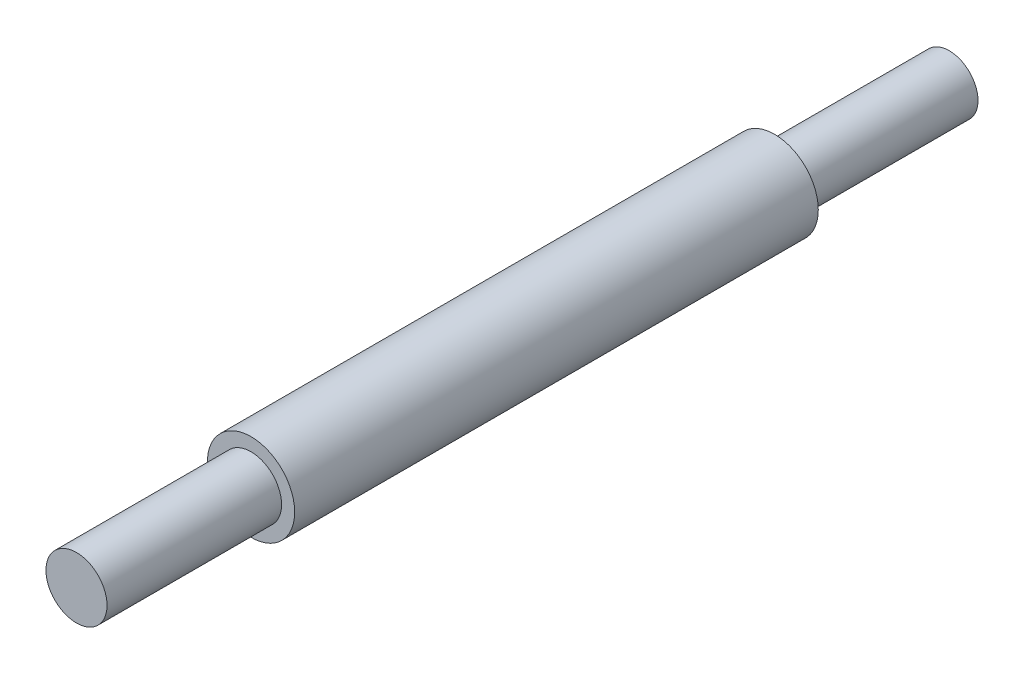
ISO-10303-21;
HEADER;
FILE_DESCRIPTION(('STEP AP214'),'2;1');
FILE_NAME('part.step','',(''),(''),'','','');
FILE_SCHEMA(('AUTOMOTIVE_DESIGN { 1 0 10303 214 1 1 1 1 }'));
ENDSEC;
DATA;
#1=APPLICATION_CONTEXT('core data for automotive mechanical design processes');
#2=APPLICATION_PROTOCOL_DEFINITION('international standard','automotive_design',2000,#1);
#3=PRODUCT_CONTEXT('',#1,'mechanical');
#4=PRODUCT('Part','Part','',(#3));
#5=PRODUCT_RELATED_PRODUCT_CATEGORY('part','',(#4));
#6=PRODUCT_DEFINITION_FORMATION('','',#4);
#7=PRODUCT_DEFINITION_CONTEXT('part definition',#1,'design');
#8=PRODUCT_DEFINITION('design','',#6,#7);
#9=PRODUCT_DEFINITION_SHAPE('','',#8);
#10=(LENGTH_UNIT() NAMED_UNIT(*) SI_UNIT(.MILLI.,.METRE.));
#11=(NAMED_UNIT(*) PLANE_ANGLE_UNIT() SI_UNIT($,.RADIAN.));
#12=(NAMED_UNIT(*) SI_UNIT($,.STERADIAN.) SOLID_ANGLE_UNIT());
#13=UNCERTAINTY_MEASURE_WITH_UNIT(LENGTH_MEASURE(1.E-05),#10,'distance_accuracy_value','');
#14=(GEOMETRIC_REPRESENTATION_CONTEXT(3) GLOBAL_UNCERTAINTY_ASSIGNED_CONTEXT((#13)) GLOBAL_UNIT_ASSIGNED_CONTEXT((#10,
#11,#12)) REPRESENTATION_CONTEXT('',''));
#15=CARTESIAN_POINT('',(0.,0.,0.));
#16=DIRECTION('',(0.,0.,1.));
#17=DIRECTION('',(1.,0.,0.));
#18=AXIS2_PLACEMENT_3D('',#15,#16,#17);
#19=CARTESIAN_POINT('',(0.,0.,40.));
#20=DIRECTION('',(0.,0.,1.));
#21=DIRECTION('',(1.,0.,0.));
#22=AXIS2_PLACEMENT_3D('',#19,#20,#21);
#23=PLANE('',#22);
#24=CARTESIAN_POINT('',(0.,0.,40.));
#25=DIRECTION('',(0.,0.,1.));
#26=DIRECTION('',(1.,0.,0.));
#27=AXIS2_PLACEMENT_3D('',#24,#25,#26);
#28=CIRCLE('',#27,2.5);
#29=CARTESIAN_POINT('',(2.5,0.,40.));
#30=VERTEX_POINT('',#29);
#31=EDGE_CURVE('E44',#30,#30,#28,.T.);
#32=ORIENTED_EDGE('',*,*,#31,.T.);
#33=EDGE_LOOP('',(#32));
#34=FACE_BOUND('',#33,.T.);
#35=CARTESIAN_POINT('',(0.,0.,40.));
#36=DIRECTION('',(0.,0.,1.));
#37=DIRECTION('',(1.,0.,0.));
#38=AXIS2_PLACEMENT_3D('',#35,#36,#37);
#39=CIRCLE('',#38,1.75);
#40=CARTESIAN_POINT('',(1.75,0.,40.));
#41=VERTEX_POINT('',#40);
#42=EDGE_CURVE('E52',#41,#41,#39,.T.);
#43=ORIENTED_EDGE('',*,*,#42,.F.);
#44=EDGE_LOOP('',(#43));
#45=FACE_BOUND('',#44,.T.);
#46=ADVANCED_FACE('F33',(#34,#45),#23,.T.);
#47=CARTESIAN_POINT('',(0.,0.,10.));
#48=DIRECTION('',(0.,0.,-1.));
#49=DIRECTION('',(-1.,0.,0.));
#50=AXIS2_PLACEMENT_3D('',#47,#48,#49);
#51=CYLINDRICAL_SURFACE('',#50,1.65);
#52=CARTESIAN_POINT('',(0.,0.,10.));
#53=DIRECTION('',(0.,0.,1.));
#54=DIRECTION('',(1.,0.,0.));
#55=AXIS2_PLACEMENT_3D('',#52,#53,#54);
#56=CIRCLE('',#55,1.65);
#57=CARTESIAN_POINT('',(1.65,0.,10.));
#58=VERTEX_POINT('',#57);
#59=EDGE_CURVE('E10',#58,#58,#56,.T.);
#60=ORIENTED_EDGE('',*,*,#59,.F.);
#61=EDGE_LOOP('',(#60));
#62=FACE_BOUND('',#61,.T.);
#63=CARTESIAN_POINT('',(0.,0.,0.));
#64=DIRECTION('',(0.,0.,1.));
#65=DIRECTION('',(1.,0.,0.));
#66=AXIS2_PLACEMENT_3D('',#63,#64,#65);
#67=CIRCLE('',#66,1.65);
#68=CARTESIAN_POINT('',(1.65,0.,0.));
#69=VERTEX_POINT('',#68);
#70=EDGE_CURVE('E37',#69,#69,#67,.T.);
#71=ORIENTED_EDGE('',*,*,#70,.T.);
#72=EDGE_LOOP('',(#71));
#73=FACE_BOUND('',#72,.T.);
#74=ADVANCED_FACE('F35',(#62,#73),#51,.T.);
#75=CARTESIAN_POINT('',(0.,0.,0.));
#76=DIRECTION('',(0.,0.,1.));
#77=DIRECTION('',(1.,0.,0.));
#78=AXIS2_PLACEMENT_3D('',#75,#76,#77);
#79=PLANE('',#78);
#80=ORIENTED_EDGE('',*,*,#70,.F.);
#81=EDGE_LOOP('',(#80));
#82=FACE_BOUND('',#81,.T.);
#83=ADVANCED_FACE('F73',(#82),#79,.F.);
#84=CARTESIAN_POINT('',(0.,0.,10.));
#85=DIRECTION('',(0.,0.,1.));
#86=DIRECTION('',(1.,0.,0.));
#87=AXIS2_PLACEMENT_3D('',#84,#85,#86);
#88=PLANE('',#87);
#89=CARTESIAN_POINT('',(0.,0.,10.));
#90=DIRECTION('',(0.,0.,1.));
#91=DIRECTION('',(1.,0.,0.));
#92=AXIS2_PLACEMENT_3D('',#89,#90,#91);
#93=CIRCLE('',#92,2.5);
#94=CARTESIAN_POINT('',(2.5,0.,10.));
#95=VERTEX_POINT('',#94);
#96=EDGE_CURVE('E46',#95,#95,#93,.T.);
#97=ORIENTED_EDGE('',*,*,#96,.F.);
#98=EDGE_LOOP('',(#97));
#99=FACE_BOUND('',#98,.T.);
#100=ORIENTED_EDGE('',*,*,#59,.T.);
#101=EDGE_LOOP('',(#100));
#102=FACE_BOUND('',#101,.T.);
#103=ADVANCED_FACE('F77',(#99,#102),#88,.F.);
#104=CARTESIAN_POINT('',(0.,0.,40.));
#105=DIRECTION('',(0.,0.,-1.));
#106=DIRECTION('',(-1.,0.,0.));
#107=AXIS2_PLACEMENT_3D('',#104,#105,#106);
#108=CYLINDRICAL_SURFACE('',#107,2.5);
#109=ORIENTED_EDGE('',*,*,#31,.F.);
#110=EDGE_LOOP('',(#109));
#111=FACE_BOUND('',#110,.T.);
#112=ORIENTED_EDGE('',*,*,#96,.T.);
#113=EDGE_LOOP('',(#112));
#114=FACE_BOUND('',#113,.T.);
#115=ADVANCED_FACE('F63',(#111,#114),#108,.T.);
#116=CARTESIAN_POINT('',(0.,0.,50.));
#117=DIRECTION('',(0.,0.,-1.));
#118=DIRECTION('',(-1.,0.,0.));
#119=AXIS2_PLACEMENT_3D('',#116,#117,#118);
#120=CYLINDRICAL_SURFACE('',#119,1.75);
#121=CARTESIAN_POINT('',(0.,0.,50.));
#122=DIRECTION('',(0.,0.,1.));
#123=DIRECTION('',(1.,0.,0.));
#124=AXIS2_PLACEMENT_3D('',#121,#122,#123);
#125=CIRCLE('',#124,1.75);
#126=CARTESIAN_POINT('',(1.75,0.,50.));
#127=VERTEX_POINT('',#126);
#128=EDGE_CURVE('E49',#127,#127,#125,.T.);
#129=ORIENTED_EDGE('',*,*,#128,.F.);
#130=EDGE_LOOP('',(#129));
#131=FACE_BOUND('',#130,.T.);
#132=ORIENTED_EDGE('',*,*,#42,.T.);
#133=EDGE_LOOP('',(#132));
#134=FACE_BOUND('',#133,.T.);
#135=ADVANCED_FACE('F60',(#131,#134),#120,.T.);
#136=CARTESIAN_POINT('',(0.,0.,50.));
#137=DIRECTION('',(0.,0.,1.));
#138=DIRECTION('',(1.,0.,0.));
#139=AXIS2_PLACEMENT_3D('',#136,#137,#138);
#140=PLANE('',#139);
#141=ORIENTED_EDGE('',*,*,#128,.T.);
#142=EDGE_LOOP('',(#141));
#143=FACE_BOUND('',#142,.T.);
#144=ADVANCED_FACE('F58',(#143),#140,.T.);
#145=CLOSED_SHELL('',(#46,#74,#83,#103,#115,#135,#144));
#146=MANIFOLD_SOLID_BREP('B2',#145);
#147=ADVANCED_BREP_SHAPE_REPRESENTATION('',(#18,#146),#14);
#148=SHAPE_DEFINITION_REPRESENTATION(#9,#147);
ENDSEC;
END-ISO-10303-21;
